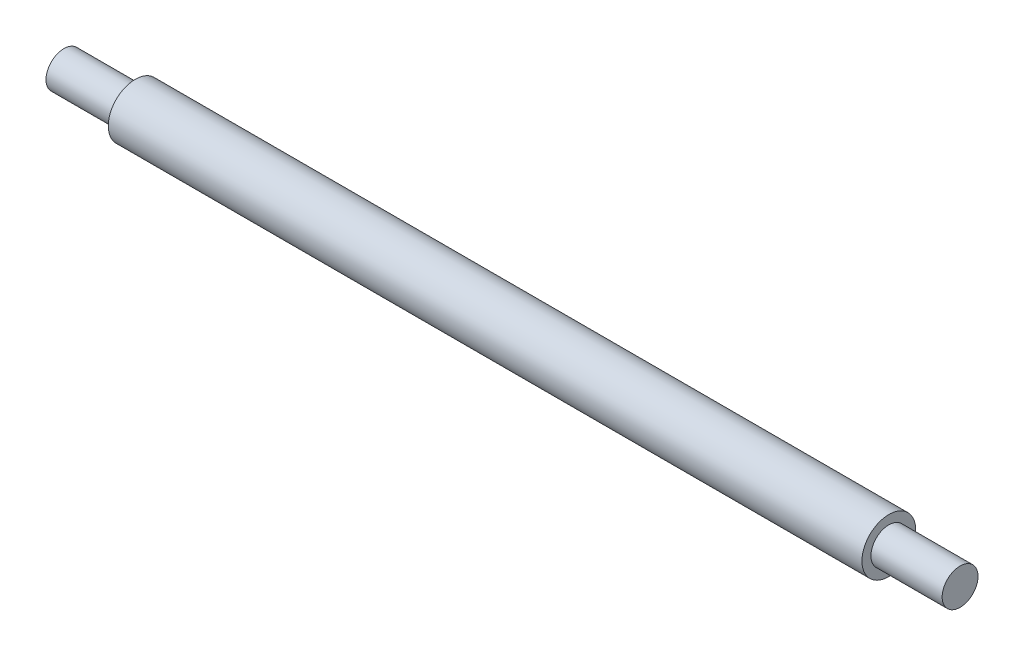
ISO-10303-21;
HEADER;
FILE_DESCRIPTION(('STEP AP214'),'2;1');
FILE_NAME('part.step','',(''),(''),'','','');
FILE_SCHEMA(('AUTOMOTIVE_DESIGN { 1 0 10303 214 1 1 1 1 }'));
ENDSEC;
DATA;
#1=APPLICATION_CONTEXT('core data for automotive mechanical design processes');
#2=APPLICATION_PROTOCOL_DEFINITION('international standard','automotive_design',2000,#1);
#3=PRODUCT_CONTEXT('',#1,'mechanical');
#4=PRODUCT('Part','Part','',(#3));
#5=PRODUCT_RELATED_PRODUCT_CATEGORY('part','',(#4));
#6=PRODUCT_DEFINITION_FORMATION('','',#4);
#7=PRODUCT_DEFINITION_CONTEXT('part definition',#1,'design');
#8=PRODUCT_DEFINITION('design','',#6,#7);
#9=PRODUCT_DEFINITION_SHAPE('','',#8);
#10=(LENGTH_UNIT() NAMED_UNIT(*) SI_UNIT(.MILLI.,.METRE.));
#11=(NAMED_UNIT(*) PLANE_ANGLE_UNIT() SI_UNIT($,.RADIAN.));
#12=(NAMED_UNIT(*) SI_UNIT($,.STERADIAN.) SOLID_ANGLE_UNIT());
#13=UNCERTAINTY_MEASURE_WITH_UNIT(LENGTH_MEASURE(1.E-05),#10,'distance_accuracy_value','');
#14=(GEOMETRIC_REPRESENTATION_CONTEXT(3) GLOBAL_UNCERTAINTY_ASSIGNED_CONTEXT((#13)) GLOBAL_UNIT_ASSIGNED_CONTEXT((#10,
#11,#12)) REPRESENTATION_CONTEXT('',''));
#15=CARTESIAN_POINT('',(0.,0.,0.));
#16=DIRECTION('',(0.,0.,1.));
#17=DIRECTION('',(1.,0.,0.));
#18=AXIS2_PLACEMENT_3D('',#15,#16,#17);
#19=CARTESIAN_POINT('',(0.,0.,0.));
#20=DIRECTION('',(1.,0.,0.));
#21=DIRECTION('',(0.,0.,-1.));
#22=AXIS2_PLACEMENT_3D('',#19,#20,#21);
#23=PLANE('',#22);
#24=CARTESIAN_POINT('',(0.,0.,0.));
#25=DIRECTION('',(-1.,0.,0.));
#26=DIRECTION('',(0.,0.,1.));
#27=AXIS2_PLACEMENT_3D('',#24,#25,#26);
#28=CIRCLE('',#27,2.);
#29=CARTESIAN_POINT('',(0.,0.,2.));
#30=VERTEX_POINT('',#29);
#31=EDGE_CURVE('E10',#30,#30,#28,.T.);
#32=ORIENTED_EDGE('',*,*,#31,.T.);
#33=EDGE_LOOP('',(#32));
#34=FACE_BOUND('',#33,.T.);
#35=ADVANCED_FACE('F32',(#34),#23,.F.);
#36=CARTESIAN_POINT('',(-15.2814470500359,0.,0.));
#37=DIRECTION('',(-1.,0.,0.));
#38=DIRECTION('',(0.,0.,1.));
#39=AXIS2_PLACEMENT_3D('',#36,#37,#38);
#40=CYLINDRICAL_SURFACE('',#39,2.);
#41=ORIENTED_EDGE('',*,*,#31,.F.);
#42=EDGE_LOOP('',(#41));
#43=FACE_BOUND('',#42,.T.);
#44=CARTESIAN_POINT('',(7.94,0.,0.));
#45=DIRECTION('',(-1.,0.,0.));
#46=DIRECTION('',(0.,0.,1.));
#47=AXIS2_PLACEMENT_3D('',#44,#45,#46);
#48=CIRCLE('',#47,2.);
#49=CARTESIAN_POINT('',(7.94,0.,2.));
#50=VERTEX_POINT('',#49);
#51=EDGE_CURVE('E38',#50,#50,#48,.T.);
#52=ORIENTED_EDGE('',*,*,#51,.T.);
#53=EDGE_LOOP('',(#52));
#54=FACE_BOUND('',#53,.T.);
#55=ADVANCED_FACE('F70',(#43,#54),#40,.T.);
#56=CARTESIAN_POINT('',(7.94,2.,0.));
#57=DIRECTION('',(1.,0.,0.));
#58=DIRECTION('',(0.,0.,-1.));
#59=AXIS2_PLACEMENT_3D('',#56,#57,#58);
#60=PLANE('',#59);
#61=ORIENTED_EDGE('',*,*,#51,.F.);
#62=EDGE_LOOP('',(#61));
#63=FACE_BOUND('',#62,.T.);
#64=CARTESIAN_POINT('',(7.94,0.,0.));
#65=DIRECTION('',(-1.,0.,0.));
#66=DIRECTION('',(0.,0.,1.));
#67=AXIS2_PLACEMENT_3D('',#64,#65,#66);
#68=CIRCLE('',#67,3.);
#69=CARTESIAN_POINT('',(7.94,0.,3.));
#70=VERTEX_POINT('',#69);
#71=EDGE_CURVE('E42',#70,#70,#68,.T.);
#72=ORIENTED_EDGE('',*,*,#71,.T.);
#73=EDGE_LOOP('',(#72));
#74=FACE_BOUND('',#73,.T.);
#75=ADVANCED_FACE('F74',(#63,#74),#60,.F.);
#76=CARTESIAN_POINT('',(-15.2814470500359,0.,0.));
#77=DIRECTION('',(-1.,0.,0.));
#78=DIRECTION('',(0.,0.,1.));
#79=AXIS2_PLACEMENT_3D('',#76,#77,#78);
#80=CYLINDRICAL_SURFACE('',#79,3.);
#81=ORIENTED_EDGE('',*,*,#71,.F.);
#82=EDGE_LOOP('',(#81));
#83=FACE_BOUND('',#82,.T.);
#84=CARTESIAN_POINT('',(91.94,0.,0.));
#85=DIRECTION('',(-1.,0.,0.));
#86=DIRECTION('',(0.,0.,1.));
#87=AXIS2_PLACEMENT_3D('',#84,#85,#86);
#88=CIRCLE('',#87,3.);
#89=CARTESIAN_POINT('',(91.94,0.,3.));
#90=VERTEX_POINT('',#89);
#91=EDGE_CURVE('E46',#90,#90,#88,.T.);
#92=ORIENTED_EDGE('',*,*,#91,.T.);
#93=EDGE_LOOP('',(#92));
#94=FACE_BOUND('',#93,.T.);
#95=ADVANCED_FACE('F79',(#83,#94),#80,.T.);
#96=CARTESIAN_POINT('',(91.94,3.,0.));
#97=DIRECTION('',(-1.,0.,0.));
#98=DIRECTION('',(0.,0.,1.));
#99=AXIS2_PLACEMENT_3D('',#96,#97,#98);
#100=PLANE('',#99);
#101=ORIENTED_EDGE('',*,*,#91,.F.);
#102=EDGE_LOOP('',(#101));
#103=FACE_BOUND('',#102,.T.);
#104=CARTESIAN_POINT('',(91.94,0.,0.));
#105=DIRECTION('',(-1.,0.,0.));
#106=DIRECTION('',(0.,0.,1.));
#107=AXIS2_PLACEMENT_3D('',#104,#105,#106);
#108=CIRCLE('',#107,2.);
#109=CARTESIAN_POINT('',(91.94,0.,2.));
#110=VERTEX_POINT('',#109);
#111=EDGE_CURVE('E51',#110,#110,#108,.T.);
#112=ORIENTED_EDGE('',*,*,#111,.T.);
#113=EDGE_LOOP('',(#112));
#114=FACE_BOUND('',#113,.T.);
#115=ADVANCED_FACE('F66',(#103,#114),#100,.F.);
#116=CARTESIAN_POINT('',(-15.2814470500359,0.,0.));
#117=DIRECTION('',(-1.,0.,0.));
#118=DIRECTION('',(0.,0.,1.));
#119=AXIS2_PLACEMENT_3D('',#116,#117,#118);
#120=CYLINDRICAL_SURFACE('',#119,2.);
#121=ORIENTED_EDGE('',*,*,#111,.F.);
#122=EDGE_LOOP('',(#121));
#123=FACE_BOUND('',#122,.T.);
#124=CARTESIAN_POINT('',(99.88,0.,0.));
#125=DIRECTION('',(-1.,0.,0.));
#126=DIRECTION('',(0.,0.,1.));
#127=AXIS2_PLACEMENT_3D('',#124,#125,#126);
#128=CIRCLE('',#127,2.);
#129=CARTESIAN_POINT('',(99.88,0.,2.));
#130=VERTEX_POINT('',#129);
#131=EDGE_CURVE('E54',#130,#130,#128,.T.);
#132=ORIENTED_EDGE('',*,*,#131,.T.);
#133=EDGE_LOOP('',(#132));
#134=FACE_BOUND('',#133,.T.);
#135=ADVANCED_FACE('F58',(#123,#134),#120,.T.);
#136=CARTESIAN_POINT('',(99.88,2.,0.));
#137=DIRECTION('',(-1.,0.,0.));
#138=DIRECTION('',(0.,0.,1.));
#139=AXIS2_PLACEMENT_3D('',#136,#137,#138);
#140=PLANE('',#139);
#141=ORIENTED_EDGE('',*,*,#131,.F.);
#142=EDGE_LOOP('',(#141));
#143=FACE_BOUND('',#142,.T.);
#144=ADVANCED_FACE('F60',(#143),#140,.F.);
#145=CLOSED_SHELL('',(#35,#55,#75,#95,#115,#135,#144));
#146=MANIFOLD_SOLID_BREP('B2',#145);
#147=ADVANCED_BREP_SHAPE_REPRESENTATION('',(#18,#146),#14);
#148=SHAPE_DEFINITION_REPRESENTATION(#9,#147);
ENDSEC;
END-ISO-10303-21;
